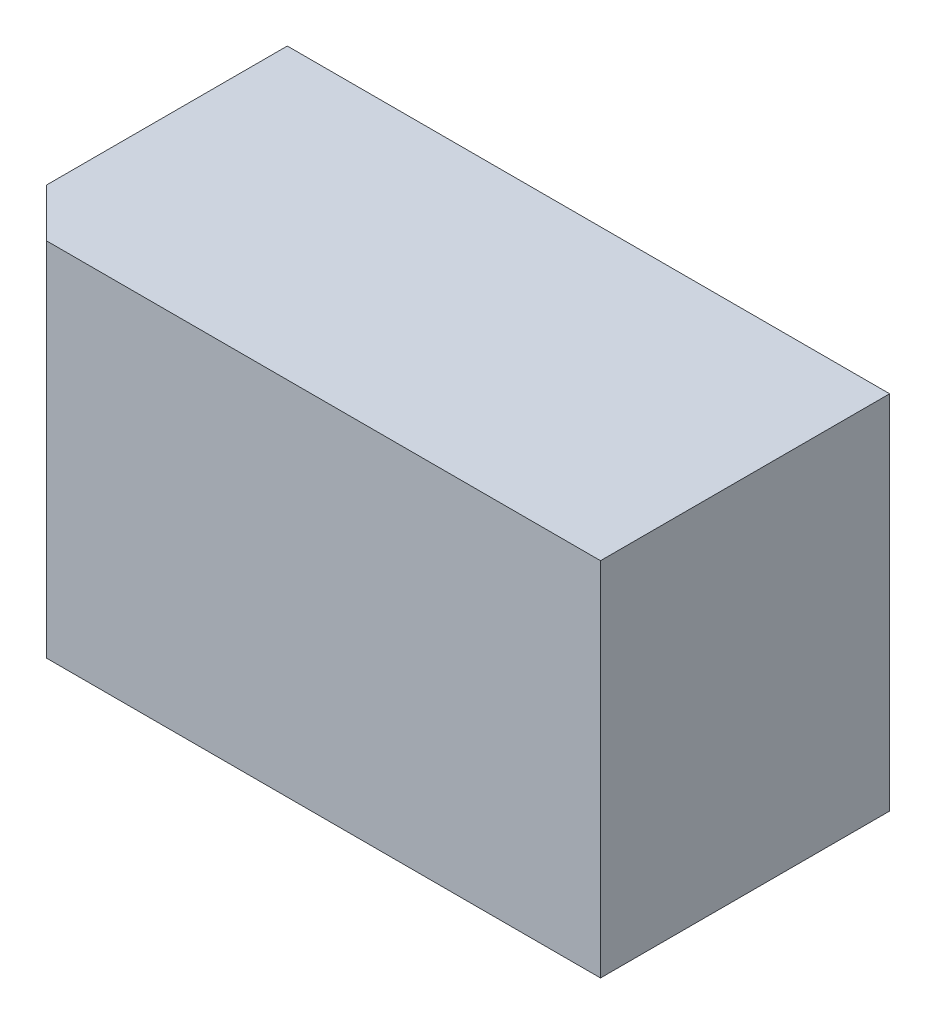
ISO-10303-21;
HEADER;
FILE_DESCRIPTION(('STEP AP214'),'2;1');
FILE_NAME('part.step','',(''),(''),'','','');
FILE_SCHEMA(('AUTOMOTIVE_DESIGN { 1 0 10303 214 1 1 1 1 }'));
ENDSEC;
DATA;
#1=APPLICATION_CONTEXT('core data for automotive mechanical design processes');
#2=APPLICATION_PROTOCOL_DEFINITION('international standard','automotive_design',2000,#1);
#3=PRODUCT_CONTEXT('',#1,'mechanical');
#4=PRODUCT('Part','Part','',(#3));
#5=PRODUCT_RELATED_PRODUCT_CATEGORY('part','',(#4));
#6=PRODUCT_DEFINITION_FORMATION('','',#4);
#7=PRODUCT_DEFINITION_CONTEXT('part definition',#1,'design');
#8=PRODUCT_DEFINITION('design','',#6,#7);
#9=PRODUCT_DEFINITION_SHAPE('','',#8);
#10=(LENGTH_UNIT() NAMED_UNIT(*) SI_UNIT(.MILLI.,.METRE.));
#11=(NAMED_UNIT(*) PLANE_ANGLE_UNIT() SI_UNIT($,.RADIAN.));
#12=(NAMED_UNIT(*) SI_UNIT($,.STERADIAN.) SOLID_ANGLE_UNIT());
#13=UNCERTAINTY_MEASURE_WITH_UNIT(LENGTH_MEASURE(1.E-05),#10,'distance_accuracy_value','');
#14=(GEOMETRIC_REPRESENTATION_CONTEXT(3) GLOBAL_UNCERTAINTY_ASSIGNED_CONTEXT((#13)) GLOBAL_UNIT_ASSIGNED_CONTEXT((#10,
#11,#12)) REPRESENTATION_CONTEXT('',''));
#15=CARTESIAN_POINT('',(0.,0.,0.));
#16=DIRECTION('',(0.,0.,1.));
#17=DIRECTION('',(1.,0.,0.));
#18=AXIS2_PLACEMENT_3D('',#15,#16,#17);
#19=CARTESIAN_POINT('',(-1.15,-0.75,1.1));
#20=DIRECTION('',(-0.707106781186548,0.,0.707106781186548));
#21=DIRECTION('',(0.707106781186548,0.,0.707106781186548));
#22=AXIS2_PLACEMENT_3D('',#19,#20,#21);
#23=PLANE('',#22);
#24=DIRECTION('',(0.,1.,0.));
#25=VECTOR('',#24,1.);
#26=CARTESIAN_POINT('',(-1.25,-0.75,1.));
#27=LINE('',#26,#25);
#28=CARTESIAN_POINT('',(-1.25,-0.75,1.));
#29=VERTEX_POINT('',#28);
#30=CARTESIAN_POINT('',(-1.25,0.750000000000001,1.));
#31=VERTEX_POINT('',#30);
#32=EDGE_CURVE('E75',#29,#31,#27,.T.);
#33=ORIENTED_EDGE('',*,*,#32,.F.);
#34=DIRECTION('',(0.707106781186548,0.,0.707106781186548));
#35=VECTOR('',#34,1.);
#36=CARTESIAN_POINT('',(-1.15,-0.75,1.1));
#37=LINE('',#36,#35);
#38=CARTESIAN_POINT('',(-1.05,-0.75,1.2));
#39=VERTEX_POINT('',#38);
#40=EDGE_CURVE('E61',#29,#39,#37,.T.);
#41=ORIENTED_EDGE('',*,*,#40,.T.);
#42=DIRECTION('',(0.,1.,0.));
#43=VECTOR('',#42,1.);
#44=CARTESIAN_POINT('',(-1.05,0.,1.2));
#45=LINE('',#44,#43);
#46=CARTESIAN_POINT('',(-1.05,0.75,1.2));
#47=VERTEX_POINT('',#46);
#48=EDGE_CURVE('E73',#47,#39,#45,.F.);
#49=ORIENTED_EDGE('',*,*,#48,.F.);
#50=DIRECTION('',(0.707106781186548,0.,0.707106781186548));
#51=VECTOR('',#50,1.);
#52=CARTESIAN_POINT('',(-1.15,0.750000000000001,1.1));
#53=LINE('',#52,#51);
#54=EDGE_CURVE('E20',#47,#31,#53,.F.);
#55=ORIENTED_EDGE('',*,*,#54,.T.);
#56=EDGE_LOOP('',(#33,#41,#49,#55));
#57=FACE_BOUND('',#56,.T.);
#58=ADVANCED_FACE('F17',(#57),#23,.T.);
#59=CARTESIAN_POINT('',(0.,0.,1.2));
#60=DIRECTION('',(0.,0.,1.));
#61=DIRECTION('',(1.,0.,0.));
#62=AXIS2_PLACEMENT_3D('',#59,#60,#61);
#63=PLANE('',#62);
#64=DIRECTION('',(1.,0.,0.));
#65=VECTOR('',#64,1.);
#66=CARTESIAN_POINT('',(1.25,-0.75,1.2));
#67=LINE('',#66,#65);
#68=CARTESIAN_POINT('',(1.25,-0.75,1.2));
#69=VERTEX_POINT('',#68);
#70=EDGE_CURVE('E72',#69,#39,#67,.F.);
#71=ORIENTED_EDGE('',*,*,#70,.F.);
#72=DIRECTION('',(0.,1.,0.));
#73=VECTOR('',#72,1.);
#74=CARTESIAN_POINT('',(1.25,0.75,1.2));
#75=LINE('',#74,#73);
#76=CARTESIAN_POINT('',(1.25,0.75,1.2));
#77=VERTEX_POINT('',#76);
#78=EDGE_CURVE('E84',#77,#69,#75,.F.);
#79=ORIENTED_EDGE('',*,*,#78,.F.);
#80=DIRECTION('',(1.,0.,0.));
#81=VECTOR('',#80,1.);
#82=CARTESIAN_POINT('',(-1.25,0.75,1.2));
#83=LINE('',#82,#81);
#84=EDGE_CURVE('E92',#47,#77,#83,.T.);
#85=ORIENTED_EDGE('',*,*,#84,.F.);
#86=ORIENTED_EDGE('',*,*,#48,.T.);
#87=EDGE_LOOP('',(#71,#79,#85,#86));
#88=FACE_BOUND('',#87,.T.);
#89=ADVANCED_FACE('F90',(#88),#63,.T.);
#90=CARTESIAN_POINT('',(-1.25,-0.75,0.));
#91=DIRECTION('',(-1.,0.,0.));
#92=DIRECTION('',(0.,0.,1.));
#93=AXIS2_PLACEMENT_3D('',#90,#91,#92);
#94=PLANE('',#93);
#95=DIRECTION('',(0.,0.,1.));
#96=VECTOR('',#95,1.);
#97=CARTESIAN_POINT('',(-1.25,0.75,0.));
#98=LINE('',#97,#96);
#99=CARTESIAN_POINT('',(-1.25,0.75,0.));
#100=VERTEX_POINT('',#99);
#101=EDGE_CURVE('E93',#100,#31,#98,.T.);
#102=ORIENTED_EDGE('',*,*,#101,.F.);
#103=DIRECTION('',(0.,1.,0.));
#104=VECTOR('',#103,1.);
#105=CARTESIAN_POINT('',(-1.25,0.,0.));
#106=LINE('',#105,#104);
#107=CARTESIAN_POINT('',(-1.25,-0.75,0.));
#108=VERTEX_POINT('',#107);
#109=EDGE_CURVE('E82',#100,#108,#106,.F.);
#110=ORIENTED_EDGE('',*,*,#109,.T.);
#111=DIRECTION('',(0.,0.,-1.));
#112=VECTOR('',#111,1.);
#113=CARTESIAN_POINT('',(-1.25,-0.75,0.));
#114=LINE('',#113,#112);
#115=EDGE_CURVE('E68',#29,#108,#114,.T.);
#116=ORIENTED_EDGE('',*,*,#115,.F.);
#117=ORIENTED_EDGE('',*,*,#32,.T.);
#118=EDGE_LOOP('',(#102,#110,#116,#117));
#119=FACE_BOUND('',#118,.T.);
#120=ADVANCED_FACE('F81',(#119),#94,.T.);
#121=CARTESIAN_POINT('',(1.25,-0.75,0.));
#122=DIRECTION('',(0.,-1.,0.));
#123=DIRECTION('',(0.,0.,-1.));
#124=AXIS2_PLACEMENT_3D('',#121,#122,#123);
#125=PLANE('',#124);
#126=ORIENTED_EDGE('',*,*,#70,.T.);
#127=ORIENTED_EDGE('',*,*,#40,.F.);
#128=ORIENTED_EDGE('',*,*,#115,.T.);
#129=DIRECTION('',(1.,0.,0.));
#130=VECTOR('',#129,1.);
#131=CARTESIAN_POINT('',(0.,-0.75,0.));
#132=LINE('',#131,#130);
#133=CARTESIAN_POINT('',(1.25,-0.75,0.));
#134=VERTEX_POINT('',#133);
#135=EDGE_CURVE('E105',#108,#134,#132,.T.);
#136=ORIENTED_EDGE('',*,*,#135,.T.);
#137=DIRECTION('',(0.,0.,-1.));
#138=VECTOR('',#137,1.);
#139=CARTESIAN_POINT('',(1.25,-0.75,0.));
#140=LINE('',#139,#138);
#141=EDGE_CURVE('E96',#69,#134,#140,.T.);
#142=ORIENTED_EDGE('',*,*,#141,.F.);
#143=EDGE_LOOP('',(#126,#127,#128,#136,#142));
#144=FACE_BOUND('',#143,.T.);
#145=ADVANCED_FACE('F65',(#144),#125,.T.);
#146=CARTESIAN_POINT('',(1.25,0.75,0.));
#147=DIRECTION('',(1.,0.,0.));
#148=DIRECTION('',(0.,0.,-1.));
#149=AXIS2_PLACEMENT_3D('',#146,#147,#148);
#150=PLANE('',#149);
#151=ORIENTED_EDGE('',*,*,#141,.T.);
#152=DIRECTION('',(0.,1.,0.));
#153=VECTOR('',#152,1.);
#154=CARTESIAN_POINT('',(1.25,0.,0.));
#155=LINE('',#154,#153);
#156=CARTESIAN_POINT('',(1.25,0.75,0.));
#157=VERTEX_POINT('',#156);
#158=EDGE_CURVE('E26',#134,#157,#155,.T.);
#159=ORIENTED_EDGE('',*,*,#158,.T.);
#160=DIRECTION('',(0.,0.,1.));
#161=VECTOR('',#160,1.);
#162=CARTESIAN_POINT('',(1.25,0.75,0.));
#163=LINE('',#162,#161);
#164=EDGE_CURVE('E34',#77,#157,#163,.F.);
#165=ORIENTED_EDGE('',*,*,#164,.F.);
#166=ORIENTED_EDGE('',*,*,#78,.T.);
#167=EDGE_LOOP('',(#151,#159,#165,#166));
#168=FACE_BOUND('',#167,.T.);
#169=ADVANCED_FACE('F101',(#168),#150,.T.);
#170=CARTESIAN_POINT('',(-1.25,0.75,0.));
#171=DIRECTION('',(0.,1.,0.));
#172=DIRECTION('',(0.,0.,1.));
#173=AXIS2_PLACEMENT_3D('',#170,#171,#172);
#174=PLANE('',#173);
#175=ORIENTED_EDGE('',*,*,#164,.T.);
#176=DIRECTION('',(1.,0.,0.));
#177=VECTOR('',#176,1.);
#178=CARTESIAN_POINT('',(0.,0.75,0.));
#179=LINE('',#178,#177);
#180=EDGE_CURVE('E11',#157,#100,#179,.F.);
#181=ORIENTED_EDGE('',*,*,#180,.T.);
#182=ORIENTED_EDGE('',*,*,#101,.T.);
#183=ORIENTED_EDGE('',*,*,#54,.F.);
#184=ORIENTED_EDGE('',*,*,#84,.T.);
#185=EDGE_LOOP('',(#175,#181,#182,#183,#184));
#186=FACE_BOUND('',#185,.T.);
#187=ADVANCED_FACE('F109',(#186),#174,.T.);
#188=CARTESIAN_POINT('',(0.,0.,0.));
#189=DIRECTION('',(0.,0.,1.));
#190=DIRECTION('',(1.,0.,0.));
#191=AXIS2_PLACEMENT_3D('',#188,#189,#190);
#192=PLANE('',#191);
#193=ORIENTED_EDGE('',*,*,#158,.F.);
#194=ORIENTED_EDGE('',*,*,#135,.F.);
#195=ORIENTED_EDGE('',*,*,#109,.F.);
#196=ORIENTED_EDGE('',*,*,#180,.F.);
#197=EDGE_LOOP('',(#193,#194,#195,#196));
#198=FACE_BOUND('',#197,.T.);
#199=ADVANCED_FACE('F108',(#198),#192,.F.);
#200=CLOSED_SHELL('',(#58,#89,#120,#145,#169,#187,#199));
#201=MANIFOLD_SOLID_BREP('B1',#200);
#202=ADVANCED_BREP_SHAPE_REPRESENTATION('',(#18,#201),#14);
#203=SHAPE_DEFINITION_REPRESENTATION(#9,#202);
ENDSEC;
END-ISO-10303-21;
